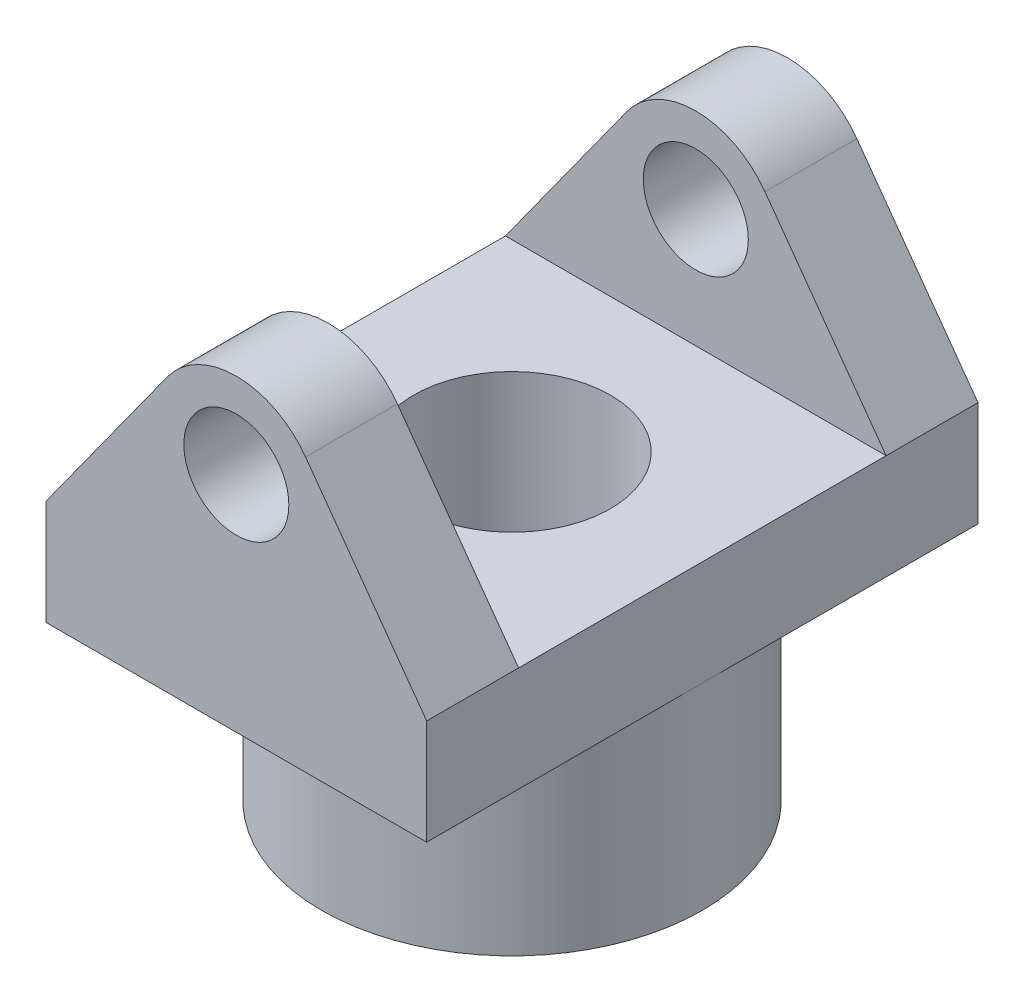
ISO-10303-21;
HEADER;
FILE_DESCRIPTION(('STEP AP214'),'2;1');
FILE_NAME('part.step','',(''),(''),'','','');
FILE_SCHEMA(('AUTOMOTIVE_DESIGN { 1 0 10303 214 1 1 1 1 }'));
ENDSEC;
DATA;
#1=APPLICATION_CONTEXT('core data for automotive mechanical design processes');
#2=APPLICATION_PROTOCOL_DEFINITION('international standard','automotive_design',2000,#1);
#3=PRODUCT_CONTEXT('',#1,'mechanical');
#4=PRODUCT('Part','Part','',(#3));
#5=PRODUCT_RELATED_PRODUCT_CATEGORY('part','',(#4));
#6=PRODUCT_DEFINITION_FORMATION('','',#4);
#7=PRODUCT_DEFINITION_CONTEXT('part definition',#1,'design');
#8=PRODUCT_DEFINITION('design','',#6,#7);
#9=PRODUCT_DEFINITION_SHAPE('','',#8);
#10=(LENGTH_UNIT() NAMED_UNIT(*) SI_UNIT(.MILLI.,.METRE.));
#11=(NAMED_UNIT(*) PLANE_ANGLE_UNIT() SI_UNIT($,.RADIAN.));
#12=(NAMED_UNIT(*) SI_UNIT($,.STERADIAN.) SOLID_ANGLE_UNIT());
#13=UNCERTAINTY_MEASURE_WITH_UNIT(LENGTH_MEASURE(1.E-05),#10,'distance_accuracy_value','');
#14=(GEOMETRIC_REPRESENTATION_CONTEXT(3) GLOBAL_UNCERTAINTY_ASSIGNED_CONTEXT((#13)) GLOBAL_UNIT_ASSIGNED_CONTEXT((#10,
#11,#12)) REPRESENTATION_CONTEXT('',''));
#15=CARTESIAN_POINT('',(0.,0.,0.));
#16=DIRECTION('',(0.,0.,1.));
#17=DIRECTION('',(1.,0.,0.));
#18=AXIS2_PLACEMENT_3D('',#15,#16,#17);
#19=CARTESIAN_POINT('',(0.,30.,0.));
#20=DIRECTION('',(0.,-1.,0.));
#21=DIRECTION('',(0.,0.,-1.));
#22=AXIS2_PLACEMENT_3D('',#19,#20,#21);
#23=CYLINDRICAL_SURFACE('',#22,29.);
#24=CARTESIAN_POINT('',(0.,30.,0.));
#25=DIRECTION('',(0.,1.,0.));
#26=DIRECTION('',(0.,0.,1.));
#27=AXIS2_PLACEMENT_3D('',#24,#25,#26);
#28=CIRCLE('',#27,29.);
#29=CARTESIAN_POINT('',(29.,30.,0.));
#30=VERTEX_POINT('',#29);
#31=CARTESIAN_POINT('',(-29.,30.,0.));
#32=VERTEX_POINT('',#31);
#33=EDGE_CURVE('E268',#30,#32,#28,.T.);
#34=ORIENTED_EDGE('',*,*,#33,.F.);
#35=EDGE_CURVE('E271',#32,#30,#28,.T.);
#36=ORIENTED_EDGE('',*,*,#35,.F.);
#37=EDGE_LOOP('',(#34,#36));
#38=FACE_BOUND('',#37,.T.);
#39=CARTESIAN_POINT('',(0.,0.,0.));
#40=DIRECTION('',(0.,1.,0.));
#41=DIRECTION('',(0.,0.,1.));
#42=AXIS2_PLACEMENT_3D('',#39,#40,#41);
#43=CIRCLE('',#42,29.);
#44=CARTESIAN_POINT('',(0.,0.,29.));
#45=VERTEX_POINT('',#44);
#46=EDGE_CURVE('E267',#45,#45,#43,.T.);
#47=ORIENTED_EDGE('',*,*,#46,.T.);
#48=EDGE_LOOP('',(#47));
#49=FACE_BOUND('',#48,.T.);
#50=ADVANCED_FACE('F39',(#38,#49),#23,.T.);
#51=CARTESIAN_POINT('',(0.,0.,0.));
#52=DIRECTION('',(0.,1.,0.));
#53=DIRECTION('',(0.,0.,1.));
#54=AXIS2_PLACEMENT_3D('',#51,#52,#53);
#55=PLANE('',#54);
#56=CARTESIAN_POINT('',(0.,0.,0.));
#57=DIRECTION('',(0.,-1.,0.));
#58=DIRECTION('',(0.,0.,-1.));
#59=AXIS2_PLACEMENT_3D('',#56,#57,#58);
#60=CIRCLE('',#59,15.);
#61=CARTESIAN_POINT('',(-4.,0.,14.456832294801));
#62=VERTEX_POINT('',#61);
#63=CARTESIAN_POINT('',(4.,0.,14.456832294801));
#64=VERTEX_POINT('',#63);
#65=EDGE_CURVE('E157',#62,#64,#60,.T.);
#66=ORIENTED_EDGE('',*,*,#65,.F.);
#67=DIRECTION('',(0.,0.,-1.));
#68=VECTOR('',#67,1.);
#69=CARTESIAN_POINT('',(-4.,0.,17.456832294801));
#70=LINE('',#69,#68);
#71=CARTESIAN_POINT('',(-4.,0.,17.456832294801));
#72=VERTEX_POINT('',#71);
#73=EDGE_CURVE('E53',#72,#62,#70,.T.);
#74=ORIENTED_EDGE('',*,*,#73,.F.);
#75=DIRECTION('',(-1.,0.,0.));
#76=VECTOR('',#75,1.);
#77=CARTESIAN_POINT('',(-4.,0.,17.456832294801));
#78=LINE('',#77,#76);
#79=CARTESIAN_POINT('',(4.,0.,17.456832294801));
#80=VERTEX_POINT('',#79);
#81=EDGE_CURVE('E164',#80,#72,#78,.T.);
#82=ORIENTED_EDGE('',*,*,#81,.F.);
#83=DIRECTION('',(0.,0.,1.));
#84=VECTOR('',#83,1.);
#85=CARTESIAN_POINT('',(4.,0.,17.456832294801));
#86=LINE('',#85,#84);
#87=EDGE_CURVE('E148',#64,#80,#86,.T.);
#88=ORIENTED_EDGE('',*,*,#87,.F.);
#89=EDGE_LOOP('',(#66,#74,#82,#88));
#90=FACE_BOUND('',#89,.T.);
#91=ORIENTED_EDGE('',*,*,#46,.F.);
#92=EDGE_LOOP('',(#91));
#93=FACE_BOUND('',#92,.T.);
#94=ADVANCED_FACE('F161',(#90,#93),#55,.F.);
#95=CARTESIAN_POINT('',(0.,30.,0.));
#96=DIRECTION('',(0.,-1.,0.));
#97=DIRECTION('',(0.,0.,-1.));
#98=AXIS2_PLACEMENT_3D('',#95,#96,#97);
#99=PLANE('',#98);
#100=ORIENTED_EDGE('',*,*,#33,.T.);
#101=DIRECTION('',(0.,0.,1.));
#102=VECTOR('',#101,1.);
#103=CARTESIAN_POINT('',(-29.,30.,42.));
#104=LINE('',#103,#102);
#105=CARTESIAN_POINT('',(-29.,30.,-42.));
#106=VERTEX_POINT('',#105);
#107=EDGE_CURVE('E251',#106,#32,#104,.T.);
#108=ORIENTED_EDGE('',*,*,#107,.F.);
#109=DIRECTION('',(-1.,0.,0.));
#110=VECTOR('',#109,1.);
#111=CARTESIAN_POINT('',(-29.,30.,-42.));
#112=LINE('',#111,#110);
#113=CARTESIAN_POINT('',(29.,30.,-42.));
#114=VERTEX_POINT('',#113);
#115=EDGE_CURVE('E248',#114,#106,#112,.T.);
#116=ORIENTED_EDGE('',*,*,#115,.F.);
#117=DIRECTION('',(0.,0.,-1.));
#118=VECTOR('',#117,1.);
#119=CARTESIAN_POINT('',(29.,30.,-42.));
#120=LINE('',#119,#118);
#121=EDGE_CURVE('E235',#30,#114,#120,.T.);
#122=ORIENTED_EDGE('',*,*,#121,.F.);
#123=EDGE_LOOP('',(#100,#108,#116,#122));
#124=FACE_BOUND('',#123,.T.);
#125=ADVANCED_FACE('F306',(#124),#99,.T.);
#126=CARTESIAN_POINT('',(29.,46.,-42.));
#127=DIRECTION('',(-1.,0.,0.));
#128=DIRECTION('',(0.,0.,1.));
#129=AXIS2_PLACEMENT_3D('',#126,#127,#128);
#130=PLANE('',#129);
#131=ORIENTED_EDGE('',*,*,#121,.T.);
#132=DIRECTION('',(0.,-1.,0.));
#133=VECTOR('',#132,1.);
#134=CARTESIAN_POINT('',(29.,46.,-42.));
#135=LINE('',#134,#133);
#136=CARTESIAN_POINT('',(29.,46.,-42.));
#137=VERTEX_POINT('',#136);
#138=EDGE_CURVE('E264',#137,#114,#135,.T.);
#139=ORIENTED_EDGE('',*,*,#138,.F.);
#140=DIRECTION('',(0.,0.,-1.));
#141=VECTOR('',#140,1.);
#142=CARTESIAN_POINT('',(29.,46.,-28.));
#143=LINE('',#142,#141);
#144=CARTESIAN_POINT('',(29.,46.,-28.));
#145=VERTEX_POINT('',#144);
#146=EDGE_CURVE('E194',#145,#137,#143,.T.);
#147=ORIENTED_EDGE('',*,*,#146,.F.);
#148=DIRECTION('',(0.,0.,-1.));
#149=VECTOR('',#148,1.);
#150=CARTESIAN_POINT('',(29.,46.,-42.));
#151=LINE('',#150,#149);
#152=CARTESIAN_POINT('',(29.,46.,28.));
#153=VERTEX_POINT('',#152);
#154=EDGE_CURVE('E240',#153,#145,#151,.T.);
#155=ORIENTED_EDGE('',*,*,#154,.F.);
#156=CARTESIAN_POINT('',(29.,46.,42.));
#157=VERTEX_POINT('',#156);
#158=EDGE_CURVE('E236',#157,#153,#151,.T.);
#159=ORIENTED_EDGE('',*,*,#158,.F.);
#160=DIRECTION('',(0.,-1.,0.));
#161=VECTOR('',#160,1.);
#162=CARTESIAN_POINT('',(29.,46.,42.));
#163=LINE('',#162,#161);
#164=CARTESIAN_POINT('',(29.,30.,42.));
#165=VERTEX_POINT('',#164);
#166=EDGE_CURVE('E244',#157,#165,#163,.T.);
#167=ORIENTED_EDGE('',*,*,#166,.T.);
#168=EDGE_CURVE('E245',#165,#30,#120,.T.);
#169=ORIENTED_EDGE('',*,*,#168,.T.);
#170=EDGE_LOOP('',(#131,#139,#147,#155,#159,#167,#169));
#171=FACE_BOUND('',#170,.T.);
#172=ADVANCED_FACE('F317',(#171),#130,.F.);
#173=CARTESIAN_POINT('',(-29.,46.,-42.));
#174=DIRECTION('',(0.,0.,1.));
#175=DIRECTION('',(1.,0.,0.));
#176=AXIS2_PLACEMENT_3D('',#173,#174,#175);
#177=PLANE('',#176);
#178=ORIENTED_EDGE('',*,*,#115,.T.);
#179=DIRECTION('',(0.,-1.,0.));
#180=VECTOR('',#179,1.);
#181=CARTESIAN_POINT('',(-29.,46.,-42.));
#182=LINE('',#181,#180);
#183=CARTESIAN_POINT('',(-29.,46.,-42.));
#184=VERTEX_POINT('',#183);
#185=EDGE_CURVE('E261',#184,#106,#182,.T.);
#186=ORIENTED_EDGE('',*,*,#185,.F.);
#187=DIRECTION('',(-0.584742113826138,-0.811219243064499,0.));
#188=VECTOR('',#187,1.);
#189=CARTESIAN_POINT('',(-29.,46.,-42.));
#190=LINE('',#189,#188);
#191=CARTESIAN_POINT('',(-10.5458501598385,71.6016474797398,-42.));
#192=VERTEX_POINT('',#191);
#193=EDGE_CURVE('E177',#192,#184,#190,.T.);
#194=ORIENTED_EDGE('',*,*,#193,.F.);
#195=CARTESIAN_POINT('',(0.,64.,-42.));
#196=DIRECTION('',(0.,0.,1.));
#197=DIRECTION('',(-1.,0.,0.));
#198=AXIS2_PLACEMENT_3D('',#195,#196,#197);
#199=CIRCLE('',#198,13.);
#200=CARTESIAN_POINT('',(10.5458501598385,71.6016474797398,-42.));
#201=VERTEX_POINT('',#200);
#202=EDGE_CURVE('E191',#201,#192,#199,.T.);
#203=ORIENTED_EDGE('',*,*,#202,.F.);
#204=DIRECTION('',(-0.584742113826138,0.8112192430645,0.));
#205=VECTOR('',#204,1.);
#206=CARTESIAN_POINT('',(10.5458501598385,71.6016474797398,-42.));
#207=LINE('',#206,#205);
#208=EDGE_CURVE('E184',#137,#201,#207,.T.);
#209=ORIENTED_EDGE('',*,*,#208,.F.);
#210=ORIENTED_EDGE('',*,*,#138,.T.);
#211=EDGE_LOOP('',(#178,#186,#194,#203,#209,#210));
#212=FACE_BOUND('',#211,.T.);
#213=CARTESIAN_POINT('',(0.,64.,-42.));
#214=DIRECTION('',(0.,0.,1.));
#215=DIRECTION('',(1.,0.,0.));
#216=AXIS2_PLACEMENT_3D('',#213,#214,#215);
#217=CIRCLE('',#216,8.);
#218=CARTESIAN_POINT('',(8.,64.,-42.));
#219=VERTEX_POINT('',#218);
#220=EDGE_CURVE('E171',#219,#219,#217,.T.);
#221=ORIENTED_EDGE('',*,*,#220,.T.);
#222=EDGE_LOOP('',(#221));
#223=FACE_BOUND('',#222,.T.);
#224=ADVANCED_FACE('F366',(#212,#223),#177,.F.);
#225=CARTESIAN_POINT('',(-29.,46.,42.));
#226=DIRECTION('',(1.,0.,0.));
#227=DIRECTION('',(0.,0.,-1.));
#228=AXIS2_PLACEMENT_3D('',#225,#226,#227);
#229=PLANE('',#228);
#230=DIRECTION('',(0.,0.,1.));
#231=VECTOR('',#230,1.);
#232=CARTESIAN_POINT('',(-29.,46.,42.));
#233=LINE('',#232,#231);
#234=CARTESIAN_POINT('',(-29.,46.,-28.));
#235=VERTEX_POINT('',#234);
#236=CARTESIAN_POINT('',(-29.,46.,28.));
#237=VERTEX_POINT('',#236);
#238=EDGE_CURVE('E239',#235,#237,#233,.T.);
#239=ORIENTED_EDGE('',*,*,#238,.F.);
#240=EDGE_CURVE('E241',#184,#235,#233,.T.);
#241=ORIENTED_EDGE('',*,*,#240,.F.);
#242=ORIENTED_EDGE('',*,*,#185,.T.);
#243=ORIENTED_EDGE('',*,*,#107,.T.);
#244=CARTESIAN_POINT('',(-29.,30.,42.));
#245=VERTEX_POINT('',#244);
#246=EDGE_CURVE('E250',#32,#245,#104,.T.);
#247=ORIENTED_EDGE('',*,*,#246,.T.);
#248=DIRECTION('',(0.,-1.,0.));
#249=VECTOR('',#248,1.);
#250=CARTESIAN_POINT('',(-29.,46.,42.));
#251=LINE('',#250,#249);
#252=CARTESIAN_POINT('',(-29.,46.,42.));
#253=VERTEX_POINT('',#252);
#254=EDGE_CURVE('E258',#253,#245,#251,.T.);
#255=ORIENTED_EDGE('',*,*,#254,.F.);
#256=DIRECTION('',(0.,0.,1.));
#257=VECTOR('',#256,1.);
#258=CARTESIAN_POINT('',(-29.,46.,28.));
#259=LINE('',#258,#257);
#260=EDGE_CURVE('E227',#237,#253,#259,.T.);
#261=ORIENTED_EDGE('',*,*,#260,.F.);
#262=EDGE_LOOP('',(#239,#241,#242,#243,#247,#255,#261));
#263=FACE_BOUND('',#262,.T.);
#264=ADVANCED_FACE('F324',(#263),#229,.F.);
#265=CARTESIAN_POINT('',(29.,46.,42.));
#266=DIRECTION('',(0.,0.,-1.));
#267=DIRECTION('',(-1.,0.,0.));
#268=AXIS2_PLACEMENT_3D('',#265,#266,#267);
#269=PLANE('',#268);
#270=DIRECTION('',(1.,0.,0.));
#271=VECTOR('',#270,1.);
#272=CARTESIAN_POINT('',(29.,30.,42.));
#273=LINE('',#272,#271);
#274=EDGE_CURVE('E254',#245,#165,#273,.T.);
#275=ORIENTED_EDGE('',*,*,#274,.T.);
#276=ORIENTED_EDGE('',*,*,#166,.F.);
#277=DIRECTION('',(-0.584742113826138,0.8112192430645,0.));
#278=VECTOR('',#277,1.);
#279=CARTESIAN_POINT('',(10.5458501598385,71.6016474797398,42.));
#280=LINE('',#279,#278);
#281=CARTESIAN_POINT('',(10.5458501598385,71.6016474797398,42.));
#282=VERTEX_POINT('',#281);
#283=EDGE_CURVE('E206',#157,#282,#280,.T.);
#284=ORIENTED_EDGE('',*,*,#283,.T.);
#285=CARTESIAN_POINT('',(0.,64.,42.));
#286=DIRECTION('',(0.,0.,1.));
#287=DIRECTION('',(-1.,0.,0.));
#288=AXIS2_PLACEMENT_3D('',#285,#286,#287);
#289=CIRCLE('',#288,13.);
#290=CARTESIAN_POINT('',(-10.5458501598385,71.6016474797398,42.));
#291=VERTEX_POINT('',#290);
#292=EDGE_CURVE('E222',#282,#291,#289,.T.);
#293=ORIENTED_EDGE('',*,*,#292,.T.);
#294=DIRECTION('',(-0.584742113826138,-0.811219243064499,0.));
#295=VECTOR('',#294,1.);
#296=CARTESIAN_POINT('',(-29.,46.,42.));
#297=LINE('',#296,#295);
#298=EDGE_CURVE('E213',#291,#253,#297,.T.);
#299=ORIENTED_EDGE('',*,*,#298,.T.);
#300=ORIENTED_EDGE('',*,*,#254,.T.);
#301=EDGE_LOOP('',(#275,#276,#284,#293,#299,#300));
#302=FACE_BOUND('',#301,.T.);
#303=CARTESIAN_POINT('',(0.,64.,42.));
#304=DIRECTION('',(0.,0.,1.));
#305=DIRECTION('',(1.,0.,0.));
#306=AXIS2_PLACEMENT_3D('',#303,#304,#305);
#307=CIRCLE('',#306,8.);
#308=CARTESIAN_POINT('',(8.,64.,42.));
#309=VERTEX_POINT('',#308);
#310=EDGE_CURVE('E197',#309,#309,#307,.T.);
#311=ORIENTED_EDGE('',*,*,#310,.F.);
#312=EDGE_LOOP('',(#311));
#313=FACE_BOUND('',#312,.T.);
#314=ADVANCED_FACE('F327',(#302,#313),#269,.F.);
#315=CARTESIAN_POINT('',(0.,46.,0.));
#316=DIRECTION('',(0.,-1.,0.));
#317=DIRECTION('',(0.,0.,-1.));
#318=AXIS2_PLACEMENT_3D('',#315,#316,#317);
#319=PLANE('',#318);
#320=DIRECTION('',(-1.,0.,0.));
#321=VECTOR('',#320,1.);
#322=CARTESIAN_POINT('',(0.,46.,17.456832294801));
#323=LINE('',#322,#321);
#324=CARTESIAN_POINT('',(4.,46.,17.456832294801));
#325=VERTEX_POINT('',#324);
#326=CARTESIAN_POINT('',(-4.,46.,17.456832294801));
#327=VERTEX_POINT('',#326);
#328=EDGE_CURVE('E46',#325,#327,#323,.T.);
#329=ORIENTED_EDGE('',*,*,#328,.T.);
#330=DIRECTION('',(0.,0.,-1.));
#331=VECTOR('',#330,1.);
#332=CARTESIAN_POINT('',(-3.99999999999999,46.,0.));
#333=LINE('',#332,#331);
#334=CARTESIAN_POINT('',(-4.,46.,14.456832294801));
#335=VERTEX_POINT('',#334);
#336=EDGE_CURVE('E11',#327,#335,#333,.T.);
#337=ORIENTED_EDGE('',*,*,#336,.T.);
#338=CARTESIAN_POINT('',(0.,46.,0.));
#339=DIRECTION('',(0.,-1.,0.));
#340=DIRECTION('',(0.,0.,-1.));
#341=AXIS2_PLACEMENT_3D('',#338,#339,#340);
#342=CIRCLE('',#341,15.);
#343=CARTESIAN_POINT('',(4.,46.,14.456832294801));
#344=VERTEX_POINT('',#343);
#345=EDGE_CURVE('E276',#335,#344,#342,.T.);
#346=ORIENTED_EDGE('',*,*,#345,.T.);
#347=DIRECTION('',(0.,0.,1.));
#348=VECTOR('',#347,1.);
#349=CARTESIAN_POINT('',(4.,46.,0.));
#350=LINE('',#349,#348);
#351=EDGE_CURVE('E151',#344,#325,#350,.T.);
#352=ORIENTED_EDGE('',*,*,#351,.T.);
#353=EDGE_LOOP('',(#329,#337,#346,#352));
#354=FACE_BOUND('',#353,.T.);
#355=ORIENTED_EDGE('',*,*,#154,.T.);
#356=DIRECTION('',(-1.,0.,0.));
#357=VECTOR('',#356,1.);
#358=CARTESIAN_POINT('',(0.,46.,-28.));
#359=LINE('',#358,#357);
#360=EDGE_CURVE('E270',#145,#235,#359,.T.);
#361=ORIENTED_EDGE('',*,*,#360,.T.);
#362=ORIENTED_EDGE('',*,*,#238,.T.);
#363=DIRECTION('',(1.,0.,0.));
#364=VECTOR('',#363,1.);
#365=CARTESIAN_POINT('',(0.,46.,28.));
#366=LINE('',#365,#364);
#367=EDGE_CURVE('E230',#237,#153,#366,.T.);
#368=ORIENTED_EDGE('',*,*,#367,.T.);
#369=EDGE_LOOP('',(#355,#361,#362,#368));
#370=FACE_BOUND('',#369,.T.);
#371=ADVANCED_FACE('F280',(#354,#370),#319,.F.);
#372=ORIENTED_EDGE('',*,*,#35,.T.);
#373=ORIENTED_EDGE('',*,*,#168,.F.);
#374=ORIENTED_EDGE('',*,*,#274,.F.);
#375=ORIENTED_EDGE('',*,*,#246,.F.);
#376=EDGE_LOOP('',(#372,#373,#374,#375));
#377=FACE_BOUND('',#376,.T.);
#378=ADVANCED_FACE('F322',(#377),#99,.T.);
#379=CARTESIAN_POINT('',(0.,64.,28.));
#380=DIRECTION('',(0.,0.,-1.));
#381=DIRECTION('',(-1.,0.,0.));
#382=AXIS2_PLACEMENT_3D('',#379,#380,#381);
#383=PLANE('',#382);
#384=CARTESIAN_POINT('',(0.,64.,28.));
#385=DIRECTION('',(0.,0.,1.));
#386=DIRECTION('',(1.,0.,0.));
#387=AXIS2_PLACEMENT_3D('',#384,#385,#386);
#388=CIRCLE('',#387,8.);
#389=CARTESIAN_POINT('',(8.,64.,28.));
#390=VERTEX_POINT('',#389);
#391=EDGE_CURVE('E203',#390,#390,#388,.T.);
#392=ORIENTED_EDGE('',*,*,#391,.T.);
#393=EDGE_LOOP('',(#392));
#394=FACE_BOUND('',#393,.T.);
#395=ORIENTED_EDGE('',*,*,#367,.F.);
#396=DIRECTION('',(-0.584742113826138,-0.811219243064499,0.));
#397=VECTOR('',#396,1.);
#398=CARTESIAN_POINT('',(-29.,46.,28.));
#399=LINE('',#398,#397);
#400=CARTESIAN_POINT('',(-10.5458501598385,71.6016474797398,28.));
#401=VERTEX_POINT('',#400);
#402=EDGE_CURVE('E216',#401,#237,#399,.T.);
#403=ORIENTED_EDGE('',*,*,#402,.F.);
#404=CARTESIAN_POINT('',(0.,64.,28.));
#405=DIRECTION('',(0.,0.,1.));
#406=DIRECTION('',(-1.,0.,0.));
#407=AXIS2_PLACEMENT_3D('',#404,#405,#406);
#408=CIRCLE('',#407,13.);
#409=CARTESIAN_POINT('',(10.5458501598385,71.6016474797398,28.));
#410=VERTEX_POINT('',#409);
#411=EDGE_CURVE('E212',#410,#401,#408,.T.);
#412=ORIENTED_EDGE('',*,*,#411,.F.);
#413=DIRECTION('',(-0.584742113826138,0.8112192430645,0.));
#414=VECTOR('',#413,1.);
#415=CARTESIAN_POINT('',(10.5458501598385,71.6016474797398,28.));
#416=LINE('',#415,#414);
#417=EDGE_CURVE('E209',#153,#410,#416,.T.);
#418=ORIENTED_EDGE('',*,*,#417,.F.);
#419=EDGE_LOOP('',(#395,#403,#412,#418));
#420=FACE_BOUND('',#419,.T.);
#421=ADVANCED_FACE('F338',(#394,#420),#383,.T.);
#422=CARTESIAN_POINT('',(-29.,46.,28.));
#423=DIRECTION('',(-0.811219243064499,0.584742113826139,0.));
#424=DIRECTION('',(-0.584742113826139,-0.811219243064499,0.));
#425=AXIS2_PLACEMENT_3D('',#422,#423,#424);
#426=PLANE('',#425);
#427=ORIENTED_EDGE('',*,*,#298,.F.);
#428=DIRECTION('',(0.,0.,1.));
#429=VECTOR('',#428,1.);
#430=CARTESIAN_POINT('',(-10.5458501598385,71.6016474797398,28.));
#431=LINE('',#430,#429);
#432=EDGE_CURVE('E231',#401,#291,#431,.T.);
#433=ORIENTED_EDGE('',*,*,#432,.F.);
#434=ORIENTED_EDGE('',*,*,#402,.T.);
#435=ORIENTED_EDGE('',*,*,#260,.T.);
#436=EDGE_LOOP('',(#427,#433,#434,#435));
#437=FACE_BOUND('',#436,.T.);
#438=ADVANCED_FACE('F332',(#437),#426,.T.);
#439=CARTESIAN_POINT('',(0.,64.,28.));
#440=DIRECTION('',(0.,0.,1.));
#441=DIRECTION('',(1.,0.,0.));
#442=AXIS2_PLACEMENT_3D('',#439,#440,#441);
#443=CYLINDRICAL_SURFACE('',#442,13.);
#444=ORIENTED_EDGE('',*,*,#292,.F.);
#445=DIRECTION('',(0.,0.,1.));
#446=VECTOR('',#445,1.);
#447=CARTESIAN_POINT('',(10.5458501598385,71.6016474797398,28.));
#448=LINE('',#447,#446);
#449=EDGE_CURVE('E219',#410,#282,#448,.T.);
#450=ORIENTED_EDGE('',*,*,#449,.F.);
#451=ORIENTED_EDGE('',*,*,#411,.T.);
#452=ORIENTED_EDGE('',*,*,#432,.T.);
#453=EDGE_LOOP('',(#444,#450,#451,#452));
#454=FACE_BOUND('',#453,.T.);
#455=ADVANCED_FACE('F347',(#454),#443,.T.);
#456=CARTESIAN_POINT('',(10.5458501598385,71.6016474797398,28.));
#457=DIRECTION('',(0.8112192430645,0.584742113826138,0.));
#458=DIRECTION('',(-0.584742113826138,0.8112192430645,0.));
#459=AXIS2_PLACEMENT_3D('',#456,#457,#458);
#460=PLANE('',#459);
#461=ORIENTED_EDGE('',*,*,#283,.F.);
#462=ORIENTED_EDGE('',*,*,#158,.T.);
#463=ORIENTED_EDGE('',*,*,#417,.T.);
#464=ORIENTED_EDGE('',*,*,#449,.T.);
#465=EDGE_LOOP('',(#461,#462,#463,#464));
#466=FACE_BOUND('',#465,.T.);
#467=ADVANCED_FACE('F345',(#466),#460,.T.);
#468=CARTESIAN_POINT('',(0.,64.,28.));
#469=DIRECTION('',(0.,0.,1.));
#470=DIRECTION('',(1.,0.,0.));
#471=AXIS2_PLACEMENT_3D('',#468,#469,#470);
#472=CYLINDRICAL_SURFACE('',#471,8.);
#473=ORIENTED_EDGE('',*,*,#391,.F.);
#474=EDGE_LOOP('',(#473));
#475=FACE_BOUND('',#474,.T.);
#476=ORIENTED_EDGE('',*,*,#310,.T.);
#477=EDGE_LOOP('',(#476));
#478=FACE_BOUND('',#477,.T.);
#479=ADVANCED_FACE('F354',(#475,#478),#472,.F.);
#480=CARTESIAN_POINT('',(0.,64.,-28.));
#481=DIRECTION('',(0.,0.,1.));
#482=DIRECTION('',(-1.,0.,0.));
#483=AXIS2_PLACEMENT_3D('',#480,#481,#482);
#484=PLANE('',#483);
#485=CARTESIAN_POINT('',(0.,64.,-28.));
#486=DIRECTION('',(0.,0.,1.));
#487=DIRECTION('',(1.,0.,0.));
#488=AXIS2_PLACEMENT_3D('',#485,#486,#487);
#489=CIRCLE('',#488,8.);
#490=CARTESIAN_POINT('',(8.,64.,-28.));
#491=VERTEX_POINT('',#490);
#492=EDGE_CURVE('E174',#491,#491,#489,.T.);
#493=ORIENTED_EDGE('',*,*,#492,.F.);
#494=EDGE_LOOP('',(#493));
#495=FACE_BOUND('',#494,.T.);
#496=ORIENTED_EDGE('',*,*,#360,.F.);
#497=DIRECTION('',(-0.584742113826138,0.8112192430645,0.));
#498=VECTOR('',#497,1.);
#499=CARTESIAN_POINT('',(10.5458501598385,71.6016474797398,-28.));
#500=LINE('',#499,#498);
#501=CARTESIAN_POINT('',(10.5458501598385,71.6016474797398,-28.));
#502=VERTEX_POINT('',#501);
#503=EDGE_CURVE('E186',#145,#502,#500,.T.);
#504=ORIENTED_EDGE('',*,*,#503,.T.);
#505=CARTESIAN_POINT('',(0.,64.,-28.));
#506=DIRECTION('',(0.,0.,1.));
#507=DIRECTION('',(-1.,0.,0.));
#508=AXIS2_PLACEMENT_3D('',#505,#506,#507);
#509=CIRCLE('',#508,13.);
#510=CARTESIAN_POINT('',(-10.5458501598385,71.6016474797398,-28.));
#511=VERTEX_POINT('',#510);
#512=EDGE_CURVE('E183',#502,#511,#509,.T.);
#513=ORIENTED_EDGE('',*,*,#512,.T.);
#514=DIRECTION('',(-0.584742113826138,-0.811219243064499,0.));
#515=VECTOR('',#514,1.);
#516=CARTESIAN_POINT('',(-29.,46.,-28.));
#517=LINE('',#516,#515);
#518=EDGE_CURVE('E180',#511,#235,#517,.T.);
#519=ORIENTED_EDGE('',*,*,#518,.T.);
#520=EDGE_LOOP('',(#496,#504,#513,#519));
#521=FACE_BOUND('',#520,.T.);
#522=ADVANCED_FACE('F451',(#495,#521),#484,.T.);
#523=CARTESIAN_POINT('',(10.5458501598385,71.6016474797398,-28.));
#524=DIRECTION('',(-0.8112192430645,-0.584742113826138,0.));
#525=DIRECTION('',(0.584742113826138,-0.8112192430645,0.));
#526=AXIS2_PLACEMENT_3D('',#523,#524,#525);
#527=PLANE('',#526);
#528=ORIENTED_EDGE('',*,*,#208,.T.);
#529=DIRECTION('',(0.,0.,-1.));
#530=VECTOR('',#529,1.);
#531=CARTESIAN_POINT('',(10.5458501598385,71.6016474797398,-28.));
#532=LINE('',#531,#530);
#533=EDGE_CURVE('E198',#502,#201,#532,.T.);
#534=ORIENTED_EDGE('',*,*,#533,.F.);
#535=ORIENTED_EDGE('',*,*,#503,.F.);
#536=ORIENTED_EDGE('',*,*,#146,.T.);
#537=EDGE_LOOP('',(#528,#534,#535,#536));
#538=FACE_BOUND('',#537,.T.);
#539=ADVANCED_FACE('F459',(#538),#527,.F.);
#540=CARTESIAN_POINT('',(0.,64.,-28.));
#541=DIRECTION('',(0.,0.,-1.));
#542=DIRECTION('',(-1.,0.,0.));
#543=AXIS2_PLACEMENT_3D('',#540,#541,#542);
#544=CYLINDRICAL_SURFACE('',#543,13.);
#545=ORIENTED_EDGE('',*,*,#202,.T.);
#546=DIRECTION('',(0.,0.,-1.));
#547=VECTOR('',#546,1.);
#548=CARTESIAN_POINT('',(-10.5458501598385,71.6016474797398,-28.));
#549=LINE('',#548,#547);
#550=EDGE_CURVE('E188',#511,#192,#549,.T.);
#551=ORIENTED_EDGE('',*,*,#550,.F.);
#552=ORIENTED_EDGE('',*,*,#512,.F.);
#553=ORIENTED_EDGE('',*,*,#533,.T.);
#554=EDGE_LOOP('',(#545,#551,#552,#553));
#555=FACE_BOUND('',#554,.T.);
#556=ADVANCED_FACE('F468',(#555),#544,.T.);
#557=CARTESIAN_POINT('',(-29.,46.,-28.));
#558=DIRECTION('',(0.811219243064499,-0.584742113826139,0.));
#559=DIRECTION('',(0.584742113826139,0.811219243064499,0.));
#560=AXIS2_PLACEMENT_3D('',#557,#558,#559);
#561=PLANE('',#560);
#562=ORIENTED_EDGE('',*,*,#193,.T.);
#563=ORIENTED_EDGE('',*,*,#240,.T.);
#564=ORIENTED_EDGE('',*,*,#518,.F.);
#565=ORIENTED_EDGE('',*,*,#550,.T.);
#566=EDGE_LOOP('',(#562,#563,#564,#565));
#567=FACE_BOUND('',#566,.T.);
#568=ADVANCED_FACE('F295',(#567),#561,.F.);
#569=CARTESIAN_POINT('',(0.,64.,-28.));
#570=DIRECTION('',(0.,0.,-1.));
#571=DIRECTION('',(-1.,0.,0.));
#572=AXIS2_PLACEMENT_3D('',#569,#570,#571);
#573=CYLINDRICAL_SURFACE('',#572,8.);
#574=ORIENTED_EDGE('',*,*,#492,.T.);
#575=EDGE_LOOP('',(#574));
#576=FACE_BOUND('',#575,.T.);
#577=ORIENTED_EDGE('',*,*,#220,.F.);
#578=EDGE_LOOP('',(#577));
#579=FACE_BOUND('',#578,.T.);
#580=ADVANCED_FACE('F287',(#576,#579),#573,.F.);
#581=CARTESIAN_POINT('',(-4.,77.,17.456832294801));
#582=DIRECTION('',(-1.,0.,0.));
#583=DIRECTION('',(0.,0.,1.));
#584=AXIS2_PLACEMENT_3D('',#581,#582,#583);
#585=PLANE('',#584);
#586=DIRECTION('',(0.,-1.,0.));
#587=VECTOR('',#586,1.);
#588=CARTESIAN_POINT('',(-4.,77.,17.456832294801));
#589=LINE('',#588,#587);
#590=EDGE_CURVE('E169',#327,#72,#589,.T.);
#591=ORIENTED_EDGE('',*,*,#590,.T.);
#592=ORIENTED_EDGE('',*,*,#73,.T.);
#593=DIRECTION('',(0.,-1.,0.));
#594=VECTOR('',#593,1.);
#595=CARTESIAN_POINT('',(-4.,77.,14.456832294801));
#596=LINE('',#595,#594);
#597=EDGE_CURVE('E154',#335,#62,#596,.T.);
#598=ORIENTED_EDGE('',*,*,#597,.F.);
#599=ORIENTED_EDGE('',*,*,#336,.F.);
#600=EDGE_LOOP('',(#591,#592,#598,#599));
#601=FACE_BOUND('',#600,.T.);
#602=ADVANCED_FACE('F285',(#601),#585,.F.);
#603=CARTESIAN_POINT('',(-4.,77.,17.456832294801));
#604=DIRECTION('',(0.,0.,1.));
#605=DIRECTION('',(1.,0.,0.));
#606=AXIS2_PLACEMENT_3D('',#603,#604,#605);
#607=PLANE('',#606);
#608=DIRECTION('',(0.,-1.,0.));
#609=VECTOR('',#608,1.);
#610=CARTESIAN_POINT('',(4.,77.,17.456832294801));
#611=LINE('',#610,#609);
#612=EDGE_CURVE('E153',#325,#80,#611,.T.);
#613=ORIENTED_EDGE('',*,*,#612,.T.);
#614=ORIENTED_EDGE('',*,*,#81,.T.);
#615=ORIENTED_EDGE('',*,*,#590,.F.);
#616=ORIENTED_EDGE('',*,*,#328,.F.);
#617=EDGE_LOOP('',(#613,#614,#615,#616));
#618=FACE_BOUND('',#617,.T.);
#619=ADVANCED_FACE('F284',(#618),#607,.F.);
#620=CARTESIAN_POINT('',(4.,77.,17.456832294801));
#621=DIRECTION('',(1.,0.,0.));
#622=DIRECTION('',(0.,0.,-1.));
#623=AXIS2_PLACEMENT_3D('',#620,#621,#622);
#624=PLANE('',#623);
#625=DIRECTION('',(0.,-1.,0.));
#626=VECTOR('',#625,1.);
#627=CARTESIAN_POINT('',(4.,77.,14.456832294801));
#628=LINE('',#627,#626);
#629=EDGE_CURVE('E61',#344,#64,#628,.T.);
#630=ORIENTED_EDGE('',*,*,#629,.T.);
#631=ORIENTED_EDGE('',*,*,#87,.T.);
#632=ORIENTED_EDGE('',*,*,#612,.F.);
#633=ORIENTED_EDGE('',*,*,#351,.F.);
#634=EDGE_LOOP('',(#630,#631,#632,#633));
#635=FACE_BOUND('',#634,.T.);
#636=ADVANCED_FACE('F145',(#635),#624,.F.);
#637=CARTESIAN_POINT('',(0.,77.,0.));
#638=DIRECTION('',(0.,-1.,0.));
#639=DIRECTION('',(0.,0.,-1.));
#640=AXIS2_PLACEMENT_3D('',#637,#638,#639);
#641=CYLINDRICAL_SURFACE('',#640,15.);
#642=ORIENTED_EDGE('',*,*,#597,.T.);
#643=ORIENTED_EDGE('',*,*,#65,.T.);
#644=ORIENTED_EDGE('',*,*,#629,.F.);
#645=ORIENTED_EDGE('',*,*,#345,.F.);
#646=EDGE_LOOP('',(#642,#643,#644,#645));
#647=FACE_BOUND('',#646,.T.);
#648=ADVANCED_FACE('F158',(#647),#641,.F.);
#649=CLOSED_SHELL('',(#50,#94,#125,#172,#224,#264,#314,#371,#378,#421,#438,#455,#467,#479,#522,
#539,#556,#568,#580,#602,#619,#636,#648));
#650=MANIFOLD_SOLID_BREP('B2',#649);
#651=ADVANCED_BREP_SHAPE_REPRESENTATION('',(#18,#650),#14);
#652=SHAPE_DEFINITION_REPRESENTATION(#9,#651);
ENDSEC;
END-ISO-10303-21;
